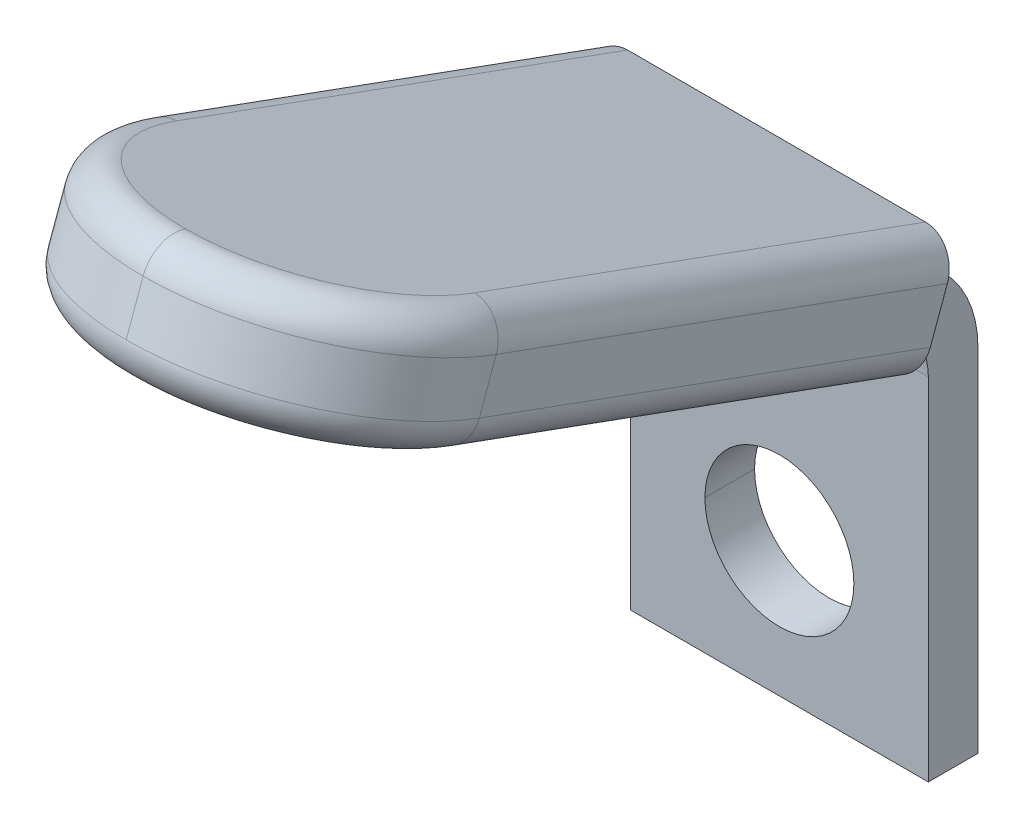
ISO-10303-21;
HEADER;
FILE_DESCRIPTION(('STEP AP214'),'2;1');
FILE_NAME('part.step','',(''),(''),'','','');
FILE_SCHEMA(('AUTOMOTIVE_DESIGN { 1 0 10303 214 1 1 1 1 }'));
ENDSEC;
DATA;
#1=APPLICATION_CONTEXT('core data for automotive mechanical design processes');
#2=APPLICATION_PROTOCOL_DEFINITION('international standard','automotive_design',2000,#1);
#3=PRODUCT_CONTEXT('',#1,'mechanical');
#4=PRODUCT('Part','Part','',(#3));
#5=PRODUCT_RELATED_PRODUCT_CATEGORY('part','',(#4));
#6=PRODUCT_DEFINITION_FORMATION('','',#4);
#7=PRODUCT_DEFINITION_CONTEXT('part definition',#1,'design');
#8=PRODUCT_DEFINITION('design','',#6,#7);
#9=PRODUCT_DEFINITION_SHAPE('','',#8);
#10=(LENGTH_UNIT() NAMED_UNIT(*) SI_UNIT(.MILLI.,.METRE.));
#11=(NAMED_UNIT(*) PLANE_ANGLE_UNIT() SI_UNIT($,.RADIAN.));
#12=(NAMED_UNIT(*) SI_UNIT($,.STERADIAN.) SOLID_ANGLE_UNIT());
#13=UNCERTAINTY_MEASURE_WITH_UNIT(LENGTH_MEASURE(1.E-05),#10,'distance_accuracy_value','');
#14=(GEOMETRIC_REPRESENTATION_CONTEXT(3) GLOBAL_UNCERTAINTY_ASSIGNED_CONTEXT((#13)) GLOBAL_UNIT_ASSIGNED_CONTEXT((#10,
#11,#12)) REPRESENTATION_CONTEXT('',''));
#15=CARTESIAN_POINT('',(0.,0.,0.));
#16=DIRECTION('',(0.,0.,1.));
#17=DIRECTION('',(1.,0.,0.));
#18=AXIS2_PLACEMENT_3D('',#15,#16,#17);
#19=CARTESIAN_POINT('',(0.,-1.936,14.5652356221816));
#20=DIRECTION('',(0.,0.,-1.));
#21=DIRECTION('',(-1.,0.,0.));
#22=AXIS2_PLACEMENT_3D('',#19,#20,#21);
#23=CYLINDRICAL_SURFACE('',#22,2.25);
#24=DIRECTION('',(0.,0.,1.));
#25=VECTOR('',#24,1.);
#26=CARTESIAN_POINT('',(2.25,-1.936,-1.5));
#27=LINE('',#26,#25);
#28=CARTESIAN_POINT('',(2.25,-1.936,-1.5));
#29=VERTEX_POINT('',#28);
#30=CARTESIAN_POINT('',(2.25,-1.936,0.));
#31=VERTEX_POINT('',#30);
#32=EDGE_CURVE('E24',#29,#31,#27,.T.);
#33=ORIENTED_EDGE('',*,*,#32,.F.);
#34=CARTESIAN_POINT('',(0.,-1.936,-1.5));
#35=DIRECTION('',(0.,0.,1.));
#36=DIRECTION('',(-1.,0.,0.));
#37=AXIS2_PLACEMENT_3D('',#34,#35,#36);
#38=CIRCLE('',#37,2.25);
#39=CARTESIAN_POINT('',(-2.25,-1.936,-1.5));
#40=VERTEX_POINT('',#39);
#41=EDGE_CURVE('E38',#40,#29,#38,.T.);
#42=ORIENTED_EDGE('',*,*,#41,.F.);
#43=DIRECTION('',(0.,0.,1.));
#44=VECTOR('',#43,1.);
#45=CARTESIAN_POINT('',(-2.25,-1.936,-1.5));
#46=LINE('',#45,#44);
#47=CARTESIAN_POINT('',(-2.25,-1.936,0.));
#48=VERTEX_POINT('',#47);
#49=EDGE_CURVE('E11',#40,#48,#46,.T.);
#50=ORIENTED_EDGE('',*,*,#49,.T.);
#51=CARTESIAN_POINT('',(0.,-1.936,0.));
#52=DIRECTION('',(0.,0.,-1.));
#53=DIRECTION('',(1.,0.,0.));
#54=AXIS2_PLACEMENT_3D('',#51,#52,#53);
#55=CIRCLE('',#54,2.25);
#56=EDGE_CURVE('E194',#31,#48,#55,.T.);
#57=ORIENTED_EDGE('',*,*,#56,.F.);
#58=EDGE_LOOP('',(#33,#42,#50,#57));
#59=FACE_BOUND('',#58,.T.);
#60=ADVANCED_FACE('F17',(#59),#23,.F.);
#61=CARTESIAN_POINT('',(0.,-1.936,14.5652356221816));
#62=DIRECTION('',(0.,0.,-1.));
#63=DIRECTION('',(-1.,0.,0.));
#64=AXIS2_PLACEMENT_3D('',#61,#62,#63);
#65=CYLINDRICAL_SURFACE('',#64,2.25);
#66=CARTESIAN_POINT('',(0.,-1.936,0.));
#67=DIRECTION('',(0.,0.,-1.));
#68=DIRECTION('',(-1.,0.,0.));
#69=AXIS2_PLACEMENT_3D('',#66,#67,#68);
#70=CIRCLE('',#69,2.25);
#71=EDGE_CURVE('E197',#48,#31,#70,.T.);
#72=ORIENTED_EDGE('',*,*,#71,.F.);
#73=ORIENTED_EDGE('',*,*,#49,.F.);
#74=CARTESIAN_POINT('',(0.,-1.936,-1.5));
#75=DIRECTION('',(0.,0.,1.));
#76=DIRECTION('',(1.,0.,0.));
#77=AXIS2_PLACEMENT_3D('',#74,#75,#76);
#78=CIRCLE('',#77,2.25);
#79=EDGE_CURVE('E204',#29,#40,#78,.T.);
#80=ORIENTED_EDGE('',*,*,#79,.F.);
#81=ORIENTED_EDGE('',*,*,#32,.T.);
#82=EDGE_LOOP('',(#72,#73,#80,#81));
#83=FACE_BOUND('',#82,.T.);
#84=ADVANCED_FACE('F212',(#83),#65,.F.);
#85=CARTESIAN_POINT('',(4.5,-6.,-1.5));
#86=DIRECTION('',(0.,0.,1.));
#87=DIRECTION('',(1.,0.,0.));
#88=AXIS2_PLACEMENT_3D('',#85,#86,#87);
#89=PLANE('',#88);
#90=ORIENTED_EDGE('',*,*,#41,.T.);
#91=ORIENTED_EDGE('',*,*,#79,.T.);
#92=EDGE_LOOP('',(#90,#91));
#93=FACE_BOUND('',#92,.T.);
#94=DIRECTION('',(-1.,0.,0.));
#95=VECTOR('',#94,1.);
#96=CARTESIAN_POINT('',(4.5,4.59958492358058,-1.5));
#97=LINE('',#96,#95);
#98=CARTESIAN_POINT('',(4.5,4.59958492358058,-1.5));
#99=VERTEX_POINT('',#98);
#100=CARTESIAN_POINT('',(-4.5,4.59958492358058,-1.5));
#101=VERTEX_POINT('',#100);
#102=EDGE_CURVE('E179',#99,#101,#97,.T.);
#103=ORIENTED_EDGE('',*,*,#102,.F.);
#104=DIRECTION('',(0.,-1.,0.));
#105=VECTOR('',#104,1.);
#106=CARTESIAN_POINT('',(4.5,4.59958492358058,-1.5));
#107=LINE('',#106,#105);
#108=CARTESIAN_POINT('',(4.5,-6.,-1.5));
#109=VERTEX_POINT('',#108);
#110=EDGE_CURVE('E31',#99,#109,#107,.T.);
#111=ORIENTED_EDGE('',*,*,#110,.T.);
#112=DIRECTION('',(1.,0.,0.));
#113=VECTOR('',#112,1.);
#114=CARTESIAN_POINT('',(-4.5,-6.,-1.5));
#115=LINE('',#114,#113);
#116=CARTESIAN_POINT('',(-4.5,-6.,-1.5));
#117=VERTEX_POINT('',#116);
#118=EDGE_CURVE('E200',#117,#109,#115,.T.);
#119=ORIENTED_EDGE('',*,*,#118,.F.);
#120=DIRECTION('',(0.,-1.,0.));
#121=VECTOR('',#120,1.);
#122=CARTESIAN_POINT('',(-4.5,4.59958492358058,-1.5));
#123=LINE('',#122,#121);
#124=EDGE_CURVE('E185',#101,#117,#123,.T.);
#125=ORIENTED_EDGE('',*,*,#124,.F.);
#126=EDGE_LOOP('',(#103,#111,#119,#125));
#127=FACE_BOUND('',#126,.T.);
#128=ADVANCED_FACE('F215',(#93,#127),#89,.F.);
#129=CARTESIAN_POINT('',(4.5,-6.,-1.5));
#130=DIRECTION('',(0.,-1.,0.));
#131=DIRECTION('',(0.,0.,-1.));
#132=AXIS2_PLACEMENT_3D('',#129,#130,#131);
#133=PLANE('',#132);
#134=ORIENTED_EDGE('',*,*,#118,.T.);
#135=DIRECTION('',(0.,0.,-1.));
#136=VECTOR('',#135,1.);
#137=CARTESIAN_POINT('',(4.5,-6.,0.));
#138=LINE('',#137,#136);
#139=CARTESIAN_POINT('',(4.5,-6.,0.));
#140=VERTEX_POINT('',#139);
#141=EDGE_CURVE('E151',#140,#109,#138,.T.);
#142=ORIENTED_EDGE('',*,*,#141,.F.);
#143=DIRECTION('',(1.,0.,0.));
#144=VECTOR('',#143,1.);
#145=CARTESIAN_POINT('',(-4.5,-6.,0.));
#146=LINE('',#145,#144);
#147=CARTESIAN_POINT('',(-4.5,-6.,0.));
#148=VERTEX_POINT('',#147);
#149=EDGE_CURVE('E147',#148,#140,#146,.T.);
#150=ORIENTED_EDGE('',*,*,#149,.F.);
#151=DIRECTION('',(0.,0.,-1.));
#152=VECTOR('',#151,1.);
#153=CARTESIAN_POINT('',(-4.5,-6.,0.));
#154=LINE('',#153,#152);
#155=EDGE_CURVE('E188',#148,#117,#154,.T.);
#156=ORIENTED_EDGE('',*,*,#155,.T.);
#157=EDGE_LOOP('',(#134,#142,#150,#156));
#158=FACE_BOUND('',#157,.T.);
#159=ADVANCED_FACE('F217',(#158),#133,.T.);
#160=CARTESIAN_POINT('',(4.5,-6.,0.));
#161=DIRECTION('',(0.,0.,1.));
#162=DIRECTION('',(1.,0.,0.));
#163=AXIS2_PLACEMENT_3D('',#160,#161,#162);
#164=PLANE('',#163);
#165=ORIENTED_EDGE('',*,*,#71,.T.);
#166=ORIENTED_EDGE('',*,*,#56,.T.);
#167=EDGE_LOOP('',(#165,#166));
#168=FACE_BOUND('',#167,.T.);
#169=ORIENTED_EDGE('',*,*,#149,.T.);
#170=DIRECTION('',(0.,-1.,0.));
#171=VECTOR('',#170,1.);
#172=CARTESIAN_POINT('',(4.5,4.59958492358058,0.));
#173=LINE('',#172,#171);
#174=CARTESIAN_POINT('',(4.5,4.59958492358058,0.));
#175=VERTEX_POINT('',#174);
#176=EDGE_CURVE('E140',#175,#140,#173,.T.);
#177=ORIENTED_EDGE('',*,*,#176,.F.);
#178=DIRECTION('',(1.,0.,0.));
#179=VECTOR('',#178,1.);
#180=CARTESIAN_POINT('',(-4.5,4.59958492358058,0.));
#181=LINE('',#180,#179);
#182=CARTESIAN_POINT('',(-4.5,4.59958492358058,0.));
#183=VERTEX_POINT('',#182);
#184=EDGE_CURVE('E145',#183,#175,#181,.T.);
#185=ORIENTED_EDGE('',*,*,#184,.F.);
#186=DIRECTION('',(0.,-1.,0.));
#187=VECTOR('',#186,1.);
#188=CARTESIAN_POINT('',(-4.5,4.59958492358058,0.));
#189=LINE('',#188,#187);
#190=EDGE_CURVE('E182',#183,#148,#189,.T.);
#191=ORIENTED_EDGE('',*,*,#190,.T.);
#192=EDGE_LOOP('',(#169,#177,#185,#191));
#193=FACE_BOUND('',#192,.T.);
#194=ADVANCED_FACE('F142',(#168,#193),#164,.T.);
#195=CARTESIAN_POINT('',(-4.5,4.59958492358058,2.));
#196=DIRECTION('',(1.,0.,0.));
#197=DIRECTION('',(0.,0.,-1.));
#198=AXIS2_PLACEMENT_3D('',#195,#196,#197);
#199=PLANE('',#198);
#200=DIRECTION('',(0.,0.93969262078591,-0.342020143325665));
#201=VECTOR('',#200,1.);
#202=CARTESIAN_POINT('',(-4.5,6.30396919006011,0.953542035160029));
#203=LINE('',#202,#201);
#204=CARTESIAN_POINT('',(-4.5,6.30396919006011,0.953542035160028));
#205=VERTEX_POINT('',#204);
#206=CARTESIAN_POINT('',(-4.5,7.72996489567215,0.434522044125824));
#207=VERTEX_POINT('',#206);
#208=EDGE_CURVE('E183',#205,#207,#203,.T.);
#209=ORIENTED_EDGE('',*,*,#208,.T.);
#210=CARTESIAN_POINT('',(-4.5,4.59958492358058,2.));
#211=DIRECTION('',(-1.,0.,0.));
#212=DIRECTION('',(0.,0.894394277740448,-0.44727941596405));
#213=AXIS2_PLACEMENT_3D('',#210,#211,#212);
#214=CIRCLE('',#213,3.5);
#215=EDGE_CURVE('E150',#207,#101,#214,.T.);
#216=ORIENTED_EDGE('',*,*,#215,.T.);
#217=ORIENTED_EDGE('',*,*,#124,.T.);
#218=ORIENTED_EDGE('',*,*,#155,.F.);
#219=ORIENTED_EDGE('',*,*,#190,.F.);
#220=CARTESIAN_POINT('',(-4.5,4.59958492358058,2.));
#221=DIRECTION('',(1.,0.,0.));
#222=DIRECTION('',(0.,0.,-1.));
#223=AXIS2_PLACEMENT_3D('',#220,#221,#222);
#224=CIRCLE('',#223,2.);
#225=EDGE_CURVE('E166',#183,#205,#224,.T.);
#226=ORIENTED_EDGE('',*,*,#225,.T.);
#227=EDGE_LOOP('',(#209,#216,#217,#218,#219,#226));
#228=FACE_BOUND('',#227,.T.);
#229=ADVANCED_FACE('F227',(#228),#199,.F.);
#230=CARTESIAN_POINT('',(4.5,4.59958492358058,2.));
#231=DIRECTION('',(-1.,0.,0.));
#232=DIRECTION('',(0.,0.,1.));
#233=AXIS2_PLACEMENT_3D('',#230,#231,#232);
#234=CYLINDRICAL_SURFACE('',#233,3.5);
#235=DIRECTION('',(1.,0.,0.));
#236=VECTOR('',#235,1.);
#237=CARTESIAN_POINT('',(-4.5,7.72996489567214,0.434522044125825));
#238=LINE('',#237,#236);
#239=CARTESIAN_POINT('',(4.5,7.72996489567215,0.434522044125824));
#240=VERTEX_POINT('',#239);
#241=EDGE_CURVE('E176',#207,#240,#238,.T.);
#242=ORIENTED_EDGE('',*,*,#241,.T.);
#243=CARTESIAN_POINT('',(4.5,4.59958492358058,2.));
#244=DIRECTION('',(1.,0.,0.));
#245=DIRECTION('',(0.,0.,-1.));
#246=AXIS2_PLACEMENT_3D('',#243,#244,#245);
#247=CIRCLE('',#246,3.5);
#248=EDGE_CURVE('E168',#99,#240,#247,.T.);
#249=ORIENTED_EDGE('',*,*,#248,.F.);
#250=ORIENTED_EDGE('',*,*,#102,.T.);
#251=ORIENTED_EDGE('',*,*,#215,.F.);
#252=EDGE_LOOP('',(#242,#249,#250,#251));
#253=FACE_BOUND('',#252,.T.);
#254=ADVANCED_FACE('F222',(#253),#234,.T.);
#255=CARTESIAN_POINT('',(4.5,4.59958492358058,2.));
#256=DIRECTION('',(1.,0.,0.));
#257=DIRECTION('',(0.,0.,-1.));
#258=AXIS2_PLACEMENT_3D('',#255,#256,#257);
#259=PLANE('',#258);
#260=CARTESIAN_POINT('',(4.5,4.59958492358058,2.));
#261=DIRECTION('',(-1.,0.,0.));
#262=DIRECTION('',(0.,0.852192133239768,-0.523228982419985));
#263=AXIS2_PLACEMENT_3D('',#260,#261,#262);
#264=CIRCLE('',#263,2.);
#265=CARTESIAN_POINT('',(4.5,6.30396919006011,0.953542035160028));
#266=VERTEX_POINT('',#265);
#267=EDGE_CURVE('E154',#266,#175,#264,.T.);
#268=ORIENTED_EDGE('',*,*,#267,.T.);
#269=ORIENTED_EDGE('',*,*,#176,.T.);
#270=ORIENTED_EDGE('',*,*,#141,.T.);
#271=ORIENTED_EDGE('',*,*,#110,.F.);
#272=ORIENTED_EDGE('',*,*,#248,.T.);
#273=DIRECTION('',(0.,-0.93969262078591,0.342020143325666));
#274=VECTOR('',#273,1.);
#275=CARTESIAN_POINT('',(4.5,7.72996489567214,0.434522044125825));
#276=LINE('',#275,#274);
#277=EDGE_CURVE('E158',#240,#266,#276,.T.);
#278=ORIENTED_EDGE('',*,*,#277,.T.);
#279=EDGE_LOOP('',(#268,#269,#270,#271,#272,#278));
#280=FACE_BOUND('',#279,.T.);
#281=ADVANCED_FACE('F155',(#280),#259,.T.);
#282=CARTESIAN_POINT('',(4.5,4.59958492358058,2.));
#283=DIRECTION('',(-1.,0.,0.));
#284=DIRECTION('',(0.,0.,1.));
#285=AXIS2_PLACEMENT_3D('',#282,#283,#284);
#286=CYLINDRICAL_SURFACE('',#285,2.);
#287=ORIENTED_EDGE('',*,*,#225,.F.);
#288=ORIENTED_EDGE('',*,*,#184,.T.);
#289=ORIENTED_EDGE('',*,*,#267,.F.);
#290=DIRECTION('',(-1.,0.,0.));
#291=VECTOR('',#290,1.);
#292=CARTESIAN_POINT('',(4.5,6.30396919006011,0.953542035160029));
#293=LINE('',#292,#291);
#294=EDGE_CURVE('E172',#266,#205,#293,.T.);
#295=ORIENTED_EDGE('',*,*,#294,.T.);
#296=EDGE_LOOP('',(#287,#288,#289,#295));
#297=FACE_BOUND('',#296,.T.);
#298=ADVANCED_FACE('F165',(#297),#286,.F.);
#299=CARTESIAN_POINT('',(-5.5,-11.0872632939833,22.714010697456));
#300=DIRECTION('',(-1.,0.,0.));
#301=DIRECTION('',(0.,0.,1.));
#302=AXIS2_PLACEMENT_3D('',#299,#300,#301);
#303=PLANE('',#302);
#304=DIRECTION('',(0.,0.342020143325666,0.939692620785909));
#305=VECTOR('',#304,1.);
#306=CARTESIAN_POINT('',(-5.5,6.34202014332567,0.939692620785908));
#307=LINE('',#306,#305);
#308=CARTESIAN_POINT('',(-5.5,6.34202014332567,0.939692620785908));
#309=VERTEX_POINT('',#308);
#310=CARTESIAN_POINT('',(-5.5,11.3013122215478,14.5652356221816));
#311=VERTEX_POINT('',#310);
#312=EDGE_CURVE('E282',#309,#311,#307,.T.);
#313=ORIENTED_EDGE('',*,*,#312,.T.);
#314=DIRECTION('',(0.,0.939692620785909,-0.342020143325666));
#315=VECTOR('',#314,1.);
#316=CARTESIAN_POINT('',(-5.5,11.3013122215478,14.5652356221816));
#317=LINE('',#316,#315);
#318=CARTESIAN_POINT('',(-5.5,12.7108511527267,14.0522054071931));
#319=VERTEX_POINT('',#318);
#320=EDGE_CURVE('E262',#311,#319,#317,.T.);
#321=ORIENTED_EDGE('',*,*,#320,.T.);
#322=DIRECTION('',(0.,-0.342020143325666,-0.93969262078591));
#323=VECTOR('',#322,1.);
#324=CARTESIAN_POINT('',(-5.5,12.7108511527267,14.0522054071931));
#325=LINE('',#324,#323);
#326=CARTESIAN_POINT('',(-5.5,7.75155907450454,0.426662405797411));
#327=VERTEX_POINT('',#326);
#328=EDGE_CURVE('E162',#319,#327,#325,.T.);
#329=ORIENTED_EDGE('',*,*,#328,.T.);
#330=DIRECTION('',(0.,-0.93969262078591,0.342020143325665));
#331=VECTOR('',#330,1.);
#332=CARTESIAN_POINT('',(-5.5,7.75155907450454,0.426662405797411));
#333=LINE('',#332,#331);
#334=EDGE_CURVE('E238',#327,#309,#333,.T.);
#335=ORIENTED_EDGE('',*,*,#334,.T.);
#336=EDGE_LOOP('',(#313,#321,#329,#335));
#337=FACE_BOUND('',#336,.T.);
#338=ADVANCED_FACE('F315',(#337),#303,.T.);
#339=CARTESIAN_POINT('',(-4.5,12.7108511527267,14.0522054071931));
#340=DIRECTION('',(0.,0.342020143325666,0.93969262078591));
#341=DIRECTION('',(0.,-0.93969262078591,0.342020143325666));
#342=AXIS2_PLACEMENT_3D('',#339,#340,#341);
#343=CYLINDRICAL_SURFACE('',#342,1.);
#344=ORIENTED_EDGE('',*,*,#328,.F.);
#345=CARTESIAN_POINT('',(-4.5,12.7108511527267,14.0522054071931));
#346=DIRECTION('',(0.,0.342020143325666,0.93969262078591));
#347=DIRECTION('',(0.,0.939692620785909,-0.342020143325666));
#348=AXIS2_PLACEMENT_3D('',#345,#346,#347);
#349=CIRCLE('',#348,1.);
#350=CARTESIAN_POINT('',(-4.5,13.6505437735126,13.7101852638674));
#351=VERTEX_POINT('',#350);
#352=EDGE_CURVE('E274',#351,#319,#349,.T.);
#353=ORIENTED_EDGE('',*,*,#352,.F.);
#354=DIRECTION('',(0.,-0.342020143325666,-0.93969262078591));
#355=VECTOR('',#354,1.);
#356=CARTESIAN_POINT('',(-4.5,13.6505437735126,13.7101852638674));
#357=LINE('',#356,#355);
#358=CARTESIAN_POINT('',(-4.5,8.69125169529045,0.0846422624717457));
#359=VERTEX_POINT('',#358);
#360=EDGE_CURVE('E264',#351,#359,#357,.T.);
#361=ORIENTED_EDGE('',*,*,#360,.T.);
#362=CARTESIAN_POINT('',(-4.5,7.75155907450453,0.426662405797411));
#363=DIRECTION('',(0.,-0.342020143325666,-0.93969262078591));
#364=DIRECTION('',(-1.,0.,0.));
#365=AXIS2_PLACEMENT_3D('',#362,#363,#364);
#366=CIRCLE('',#365,1.);
#367=EDGE_CURVE('E280',#327,#359,#366,.T.);
#368=ORIENTED_EDGE('',*,*,#367,.F.);
#369=EDGE_LOOP('',(#344,#353,#361,#368));
#370=FACE_BOUND('',#369,.T.);
#371=ADVANCED_FACE('F318',(#370),#343,.T.);
#372=CARTESIAN_POINT('',(0.,13.6505437735126,13.7101852638674));
#373=DIRECTION('',(0.,0.93969262078591,-0.342020143325666));
#374=DIRECTION('',(0.,0.342020143325666,0.93969262078591));
#375=AXIS2_PLACEMENT_3D('',#372,#373,#374);
#376=PLANE('',#375);
#377=CARTESIAN_POINT('',(0.,13.6505437735126,13.7101852638674));
#378=DIRECTION('',(0.,0.93969262078591,-0.342020143325666));
#379=DIRECTION('',(0.,0.342020143325665,0.93969262078591));
#380=AXIS2_PLACEMENT_3D('',#377,#378,#379);
#381=CIRCLE('',#380,4.5);
#382=CARTESIAN_POINT('',(0.,15.1896344184781,17.938802057404));
#383=VERTEX_POINT('',#382);
#384=CARTESIAN_POINT('',(4.5,13.6505437735126,13.7101852638674));
#385=VERTEX_POINT('',#384);
#386=EDGE_CURVE('E275',#383,#385,#381,.T.);
#387=ORIENTED_EDGE('',*,*,#386,.T.);
#388=DIRECTION('',(0.,0.342020143325666,0.93969262078591));
#389=VECTOR('',#388,1.);
#390=CARTESIAN_POINT('',(4.5,8.69125169529044,0.0846422624717451));
#391=LINE('',#390,#389);
#392=CARTESIAN_POINT('',(4.5,8.69125169529045,0.0846422624717457));
#393=VERTEX_POINT('',#392);
#394=EDGE_CURVE('E325',#393,#385,#391,.T.);
#395=ORIENTED_EDGE('',*,*,#394,.F.);
#396=DIRECTION('',(1.,0.,0.));
#397=VECTOR('',#396,1.);
#398=CARTESIAN_POINT('',(-4.5,8.69125169529045,0.0846422624717451));
#399=LINE('',#398,#397);
#400=EDGE_CURVE('E254',#359,#393,#399,.T.);
#401=ORIENTED_EDGE('',*,*,#400,.F.);
#402=ORIENTED_EDGE('',*,*,#360,.F.);
#403=CARTESIAN_POINT('',(0.,13.6505437735126,13.7101852638674));
#404=DIRECTION('',(0.,0.93969262078591,-0.342020143325666));
#405=DIRECTION('',(-1.,0.,0.));
#406=AXIS2_PLACEMENT_3D('',#403,#404,#405);
#407=CIRCLE('',#406,4.5);
#408=EDGE_CURVE('E271',#351,#383,#407,.T.);
#409=ORIENTED_EDGE('',*,*,#408,.T.);
#410=EDGE_LOOP('',(#387,#395,#401,#402,#409));
#411=FACE_BOUND('',#410,.T.);
#412=ADVANCED_FACE('F345',(#411),#376,.T.);
#413=CARTESIAN_POINT('',(4.5,5.53927754436649,1.65797985667433));
#414=DIRECTION('',(0.,-0.93969262078591,0.342020143325666));
#415=DIRECTION('',(0.,-0.342020143325666,-0.93969262078591));
#416=AXIS2_PLACEMENT_3D('',#413,#414,#415);
#417=PLANE('',#416);
#418=DIRECTION('',(0.,-0.342020143325666,-0.939692620785909));
#419=VECTOR('',#418,1.);
#420=CARTESIAN_POINT('',(4.5,10.3616196007619,14.9072557655073));
#421=LINE('',#420,#419);
#422=CARTESIAN_POINT('',(4.5,10.3616196007619,14.9072557655073));
#423=VERTEX_POINT('',#422);
#424=CARTESIAN_POINT('',(4.5,5.40232752253976,1.28171276411158));
#425=VERTEX_POINT('',#424);
#426=EDGE_CURVE('E258',#423,#425,#421,.T.);
#427=ORIENTED_EDGE('',*,*,#426,.F.);
#428=CARTESIAN_POINT('',(0.,10.3616196007619,14.9072557655073));
#429=DIRECTION('',(0.,-0.93969262078591,0.342020143325666));
#430=DIRECTION('',(1.,0.,0.));
#431=AXIS2_PLACEMENT_3D('',#428,#429,#430);
#432=CIRCLE('',#431,4.5);
#433=CARTESIAN_POINT('',(0.,11.9007102457274,19.1358725590439));
#434=VERTEX_POINT('',#433);
#435=EDGE_CURVE('E268',#423,#434,#432,.T.);
#436=ORIENTED_EDGE('',*,*,#435,.T.);
#437=CARTESIAN_POINT('',(0.,10.3616196007619,14.9072557655073));
#438=DIRECTION('',(0.,-0.93969262078591,0.342020143325666));
#439=DIRECTION('',(0.,0.342020143325666,0.93969262078591));
#440=AXIS2_PLACEMENT_3D('',#437,#438,#439);
#441=CIRCLE('',#440,4.5);
#442=CARTESIAN_POINT('',(-4.5,10.3616196007619,14.9072557655073));
#443=VERTEX_POINT('',#442);
#444=EDGE_CURVE('E266',#434,#443,#441,.T.);
#445=ORIENTED_EDGE('',*,*,#444,.T.);
#446=DIRECTION('',(0.,0.342020143325666,0.939692620785909));
#447=VECTOR('',#446,1.);
#448=CARTESIAN_POINT('',(-4.5,5.40232752253976,1.28171276411157));
#449=LINE('',#448,#447);
#450=CARTESIAN_POINT('',(-4.49999999999999,5.40232752253976,1.28171276411158));
#451=VERTEX_POINT('',#450);
#452=EDGE_CURVE('E255',#451,#443,#449,.T.);
#453=ORIENTED_EDGE('',*,*,#452,.F.);
#454=DIRECTION('',(1.,0.,0.));
#455=VECTOR('',#454,1.);
#456=CARTESIAN_POINT('',(-4.5,5.40232752253976,1.28171276411158));
#457=LINE('',#456,#455);
#458=EDGE_CURVE('E234',#451,#425,#457,.T.);
#459=ORIENTED_EDGE('',*,*,#458,.T.);
#460=EDGE_LOOP('',(#427,#436,#445,#453,#459));
#461=FACE_BOUND('',#460,.T.);
#462=ADVANCED_FACE('F391',(#461),#417,.T.);
#463=CARTESIAN_POINT('',(4.5,6.34202014332567,0.939692620785909));
#464=DIRECTION('',(0.,-0.342020143325666,-0.93969262078591));
#465=DIRECTION('',(0.,0.93969262078591,-0.342020143325666));
#466=AXIS2_PLACEMENT_3D('',#463,#464,#465);
#467=CYLINDRICAL_SURFACE('',#466,1.);
#468=ORIENTED_EDGE('',*,*,#426,.T.);
#469=CARTESIAN_POINT('',(4.5,6.34202014332567,0.939692620785912));
#470=DIRECTION('',(0.,-0.342020143325666,-0.93969262078591));
#471=DIRECTION('',(1.,0.,0.));
#472=AXIS2_PLACEMENT_3D('',#469,#470,#471);
#473=CIRCLE('',#472,1.);
#474=CARTESIAN_POINT('',(5.5,6.34202014332567,0.93969262078591));
#475=VERTEX_POINT('',#474);
#476=EDGE_CURVE('E232',#475,#425,#473,.T.);
#477=ORIENTED_EDGE('',*,*,#476,.F.);
#478=DIRECTION('',(0.,-0.342020143325666,-0.939692620785909));
#479=VECTOR('',#478,1.);
#480=CARTESIAN_POINT('',(5.5,11.3013122215478,14.5652356221816));
#481=LINE('',#480,#479);
#482=CARTESIAN_POINT('',(5.5,11.3013122215478,14.5652356221816));
#483=VERTEX_POINT('',#482);
#484=EDGE_CURVE('E246',#483,#475,#481,.T.);
#485=ORIENTED_EDGE('',*,*,#484,.F.);
#486=CARTESIAN_POINT('',(4.5,11.3013122215478,14.5652356221816));
#487=DIRECTION('',(0.,0.342020143325666,0.93969262078591));
#488=DIRECTION('',(0.,-0.939692620785909,0.342020143325666));
#489=AXIS2_PLACEMENT_3D('',#486,#487,#488);
#490=CIRCLE('',#489,1.);
#491=EDGE_CURVE('E270',#423,#483,#490,.T.);
#492=ORIENTED_EDGE('',*,*,#491,.F.);
#493=EDGE_LOOP('',(#468,#477,#485,#492));
#494=FACE_BOUND('',#493,.T.);
#495=ADVANCED_FACE('F394',(#494),#467,.T.);
#496=CARTESIAN_POINT('',(0.,-11.0872632939833,22.714010697456));
#497=DIRECTION('',(0.,0.93969262078591,-0.342020143325666));
#498=DIRECTION('',(0.,0.342020143325666,0.93969262078591));
#499=AXIS2_PLACEMENT_3D('',#496,#497,#498);
#500=CYLINDRICAL_SURFACE('',#499,5.5);
#501=CARTESIAN_POINT('',(0.,11.3013122215478,14.5652356221816));
#502=DIRECTION('',(0.,-0.93969262078591,0.342020143325666));
#503=DIRECTION('',(1.,0.,0.));
#504=AXIS2_PLACEMENT_3D('',#501,#502,#503);
#505=CIRCLE('',#504,5.5);
#506=CARTESIAN_POINT('',(0.,13.182423009839,19.7335450365041));
#507=VERTEX_POINT('',#506);
#508=EDGE_CURVE('E298',#483,#507,#505,.T.);
#509=ORIENTED_EDGE('',*,*,#508,.F.);
#510=DIRECTION('',(0.,-0.93969262078591,0.342020143325665));
#511=VECTOR('',#510,1.);
#512=CARTESIAN_POINT('',(5.5,12.7108511527267,14.0522054071931));
#513=LINE('',#512,#511);
#514=CARTESIAN_POINT('',(5.5,12.7108511527267,14.0522054071931));
#515=VERTEX_POINT('',#514);
#516=EDGE_CURVE('E175',#515,#483,#513,.T.);
#517=ORIENTED_EDGE('',*,*,#516,.F.);
#518=CARTESIAN_POINT('',(0.,12.7108511527267,14.0522054071931));
#519=DIRECTION('',(0.,0.93969262078591,-0.342020143325666));
#520=DIRECTION('',(0.,0.342020143325665,0.93969262078591));
#521=AXIS2_PLACEMENT_3D('',#518,#519,#520);
#522=CIRCLE('',#521,5.5);
#523=CARTESIAN_POINT('',(0.,14.5919619410178,19.2205148215156));
#524=VERTEX_POINT('',#523);
#525=EDGE_CURVE('E277',#524,#515,#522,.T.);
#526=ORIENTED_EDGE('',*,*,#525,.F.);
#527=DIRECTION('',(0.,-0.93969262078591,0.342020143325665));
#528=VECTOR('',#527,1.);
#529=CARTESIAN_POINT('',(0.,14.5919619410178,19.2205148215156));
#530=LINE('',#529,#528);
#531=EDGE_CURVE('E259',#524,#507,#530,.T.);
#532=ORIENTED_EDGE('',*,*,#531,.T.);
#533=EDGE_LOOP('',(#509,#517,#526,#532));
#534=FACE_BOUND('',#533,.T.);
#535=ADVANCED_FACE('F353',(#534),#500,.T.);
#536=CARTESIAN_POINT('',(5.5,-16.0465553722055,9.08846769606026));
#537=DIRECTION('',(1.,0.,0.));
#538=DIRECTION('',(0.,0.,-1.));
#539=AXIS2_PLACEMENT_3D('',#536,#537,#538);
#540=PLANE('',#539);
#541=ORIENTED_EDGE('',*,*,#484,.T.);
#542=DIRECTION('',(0.,0.939692620785909,-0.342020143325666));
#543=VECTOR('',#542,1.);
#544=CARTESIAN_POINT('',(5.5,6.34202014332567,0.939692620785909));
#545=LINE('',#544,#543);
#546=CARTESIAN_POINT('',(5.5,7.75155907450454,0.426662405797411));
#547=VERTEX_POINT('',#546);
#548=EDGE_CURVE('E252',#475,#547,#545,.T.);
#549=ORIENTED_EDGE('',*,*,#548,.T.);
#550=DIRECTION('',(0.,0.342020143325666,0.93969262078591));
#551=VECTOR('',#550,1.);
#552=CARTESIAN_POINT('',(5.5,7.75155907450453,0.426662405797413));
#553=LINE('',#552,#551);
#554=EDGE_CURVE('E247',#547,#515,#553,.T.);
#555=ORIENTED_EDGE('',*,*,#554,.T.);
#556=ORIENTED_EDGE('',*,*,#516,.T.);
#557=EDGE_LOOP('',(#541,#549,#555,#556));
#558=FACE_BOUND('',#557,.T.);
#559=ADVANCED_FACE('F348',(#558),#540,.T.);
#560=CARTESIAN_POINT('',(5.5,-16.0465553722055,9.08846769606026));
#561=DIRECTION('',(0.,-0.342020143325666,-0.93969262078591));
#562=DIRECTION('',(0.,0.93969262078591,-0.342020143325666));
#563=AXIS2_PLACEMENT_3D('',#560,#561,#562);
#564=PLANE('',#563);
#565=ORIENTED_EDGE('',*,*,#277,.F.);
#566=ORIENTED_EDGE('',*,*,#241,.F.);
#567=ORIENTED_EDGE('',*,*,#208,.F.);
#568=ORIENTED_EDGE('',*,*,#294,.F.);
#569=EDGE_LOOP('',(#565,#566,#567,#568));
#570=FACE_BOUND('',#569,.T.);
#571=ORIENTED_EDGE('',*,*,#476,.T.);
#572=ORIENTED_EDGE('',*,*,#458,.F.);
#573=CARTESIAN_POINT('',(-4.5,6.34202014332567,0.939692620785908));
#574=DIRECTION('',(0.,-0.342020143325666,-0.93969262078591));
#575=DIRECTION('',(0.,-0.939692620785909,0.342020143325665));
#576=AXIS2_PLACEMENT_3D('',#573,#574,#575);
#577=CIRCLE('',#576,1.);
#578=EDGE_CURVE('E242',#451,#309,#577,.T.);
#579=ORIENTED_EDGE('',*,*,#578,.T.);
#580=ORIENTED_EDGE('',*,*,#334,.F.);
#581=ORIENTED_EDGE('',*,*,#367,.T.);
#582=ORIENTED_EDGE('',*,*,#400,.T.);
#583=CARTESIAN_POINT('',(4.5,7.75155907450453,0.426662405797411));
#584=DIRECTION('',(0.,-0.342020143325666,-0.93969262078591));
#585=DIRECTION('',(0.,0.93969262078591,-0.342020143325665));
#586=AXIS2_PLACEMENT_3D('',#583,#584,#585);
#587=CIRCLE('',#586,1.);
#588=EDGE_CURVE('E251',#393,#547,#587,.T.);
#589=ORIENTED_EDGE('',*,*,#588,.T.);
#590=ORIENTED_EDGE('',*,*,#548,.F.);
#591=EDGE_LOOP('',(#571,#572,#579,#580,#581,#582,#589,#590));
#592=FACE_BOUND('',#591,.T.);
#593=ADVANCED_FACE('F230',(#570,#592),#564,.T.);
#594=CARTESIAN_POINT('',(-4.5,11.3013122215478,14.5652356221816));
#595=DIRECTION('',(0.,0.342020143325666,0.93969262078591));
#596=DIRECTION('',(0.,-0.939692620785909,0.342020143325666));
#597=AXIS2_PLACEMENT_3D('',#594,#595,#596);
#598=CYLINDRICAL_SURFACE('',#597,1.);
#599=ORIENTED_EDGE('',*,*,#452,.T.);
#600=CARTESIAN_POINT('',(-4.5,11.3013122215478,14.5652356221816));
#601=DIRECTION('',(0.,0.342020143325666,0.93969262078591));
#602=DIRECTION('',(-1.,0.,0.));
#603=AXIS2_PLACEMENT_3D('',#600,#601,#602);
#604=CIRCLE('',#603,1.);
#605=EDGE_CURVE('E261',#311,#443,#604,.T.);
#606=ORIENTED_EDGE('',*,*,#605,.F.);
#607=ORIENTED_EDGE('',*,*,#312,.F.);
#608=ORIENTED_EDGE('',*,*,#578,.F.);
#609=EDGE_LOOP('',(#599,#606,#607,#608));
#610=FACE_BOUND('',#609,.T.);
#611=ADVANCED_FACE('F293',(#610),#598,.T.);
#612=CARTESIAN_POINT('',(0.,11.3013122215478,14.5652356221816));
#613=DIRECTION('',(0.,-0.93969262078591,0.342020143325666));
#614=DIRECTION('',(0.,-0.342020143325666,-0.93969262078591));
#615=AXIS2_PLACEMENT_3D('',#612,#613,#614);
#616=TOROIDAL_SURFACE('',#615,4.5,1.);
#617=ORIENTED_EDGE('',*,*,#444,.F.);
#618=ORIENTED_EDGE('',*,*,#435,.F.);
#619=ORIENTED_EDGE('',*,*,#491,.T.);
#620=ORIENTED_EDGE('',*,*,#508,.T.);
#621=CARTESIAN_POINT('',(0.,11.3013122215478,14.5652356221816));
#622=DIRECTION('',(0.,-0.93969262078591,0.342020143325666));
#623=DIRECTION('',(0.,0.342020143325665,0.93969262078591));
#624=AXIS2_PLACEMENT_3D('',#621,#622,#623);
#625=CIRCLE('',#624,5.5);
#626=EDGE_CURVE('E273',#507,#311,#625,.T.);
#627=ORIENTED_EDGE('',*,*,#626,.T.);
#628=ORIENTED_EDGE('',*,*,#605,.T.);
#629=EDGE_LOOP('',(#617,#618,#619,#620,#627,#628));
#630=FACE_BOUND('',#629,.T.);
#631=ADVANCED_FACE('F303',(#630),#616,.T.);
#632=CARTESIAN_POINT('',(0.,-11.0872632939833,22.714010697456));
#633=DIRECTION('',(0.,0.93969262078591,-0.342020143325666));
#634=DIRECTION('',(0.,0.342020143325666,0.93969262078591));
#635=AXIS2_PLACEMENT_3D('',#632,#633,#634);
#636=CYLINDRICAL_SURFACE('',#635,5.5);
#637=ORIENTED_EDGE('',*,*,#531,.F.);
#638=CARTESIAN_POINT('',(0.,12.7108511527267,14.0522054071931));
#639=DIRECTION('',(0.,0.93969262078591,-0.342020143325666));
#640=DIRECTION('',(-1.,0.,0.));
#641=AXIS2_PLACEMENT_3D('',#638,#639,#640);
#642=CIRCLE('',#641,5.5);
#643=EDGE_CURVE('E312',#319,#524,#642,.T.);
#644=ORIENTED_EDGE('',*,*,#643,.F.);
#645=ORIENTED_EDGE('',*,*,#320,.F.);
#646=ORIENTED_EDGE('',*,*,#626,.F.);
#647=EDGE_LOOP('',(#637,#644,#645,#646));
#648=FACE_BOUND('',#647,.T.);
#649=ADVANCED_FACE('F310',(#648),#636,.T.);
#650=CARTESIAN_POINT('',(0.,12.7108511527267,14.0522054071931));
#651=DIRECTION('',(0.,0.93969262078591,-0.342020143325666));
#652=DIRECTION('',(0.,0.342020143325666,0.93969262078591));
#653=AXIS2_PLACEMENT_3D('',#650,#651,#652);
#654=TOROIDAL_SURFACE('',#653,4.5,1.);
#655=CARTESIAN_POINT('',(0.,14.2499417976922,18.2808222007297));
#656=DIRECTION('',(1.,0.,0.));
#657=DIRECTION('',(0.,0.939692620785909,-0.342020143325666));
#658=AXIS2_PLACEMENT_3D('',#655,#656,#657);
#659=CIRCLE('',#658,1.);
#660=EDGE_CURVE('E250',#383,#524,#659,.T.);
#661=ORIENTED_EDGE('',*,*,#660,.F.);
#662=ORIENTED_EDGE('',*,*,#408,.F.);
#663=ORIENTED_EDGE('',*,*,#352,.T.);
#664=ORIENTED_EDGE('',*,*,#643,.T.);
#665=EDGE_LOOP('',(#661,#662,#663,#664));
#666=FACE_BOUND('',#665,.T.);
#667=ADVANCED_FACE('F355',(#666),#654,.T.);
#668=CARTESIAN_POINT('',(0.,12.7108511527267,14.0522054071931));
#669=DIRECTION('',(0.,0.93969262078591,-0.342020143325666));
#670=DIRECTION('',(0.,0.342020143325666,0.93969262078591));
#671=AXIS2_PLACEMENT_3D('',#668,#669,#670);
#672=TOROIDAL_SURFACE('',#671,4.5,1.);
#673=ORIENTED_EDGE('',*,*,#525,.T.);
#674=CARTESIAN_POINT('',(4.5,12.7108511527267,14.0522054071931));
#675=DIRECTION('',(0.,0.342020143325666,0.93969262078591));
#676=DIRECTION('',(1.,0.,0.));
#677=AXIS2_PLACEMENT_3D('',#674,#675,#676);
#678=CIRCLE('',#677,1.);
#679=EDGE_CURVE('E333',#515,#385,#678,.T.);
#680=ORIENTED_EDGE('',*,*,#679,.T.);
#681=ORIENTED_EDGE('',*,*,#386,.F.);
#682=ORIENTED_EDGE('',*,*,#660,.T.);
#683=EDGE_LOOP('',(#673,#680,#681,#682));
#684=FACE_BOUND('',#683,.T.);
#685=ADVANCED_FACE('F350',(#684),#672,.T.);
#686=CARTESIAN_POINT('',(4.5,12.7108511527267,14.0522054071931));
#687=DIRECTION('',(0.,-0.342020143325666,-0.93969262078591));
#688=DIRECTION('',(0.,0.93969262078591,-0.342020143325666));
#689=AXIS2_PLACEMENT_3D('',#686,#687,#688);
#690=CYLINDRICAL_SURFACE('',#689,1.);
#691=ORIENTED_EDGE('',*,*,#554,.F.);
#692=ORIENTED_EDGE('',*,*,#588,.F.);
#693=ORIENTED_EDGE('',*,*,#394,.T.);
#694=ORIENTED_EDGE('',*,*,#679,.F.);
#695=EDGE_LOOP('',(#691,#692,#693,#694));
#696=FACE_BOUND('',#695,.T.);
#697=ADVANCED_FACE('F343',(#696),#690,.T.);
#698=CLOSED_SHELL('',(#60,#84,#128,#159,#194,#229,#254,#281,#298,#338,#371,#412,#462,#495,#535,
#559,#593,#611,#631,#649,#667,#685,#697));
#699=MANIFOLD_SOLID_BREP('B1',#698);
#700=ADVANCED_BREP_SHAPE_REPRESENTATION('',(#18,#699),#14);
#701=SHAPE_DEFINITION_REPRESENTATION(#9,#700);
ENDSEC;
END-ISO-10303-21;
